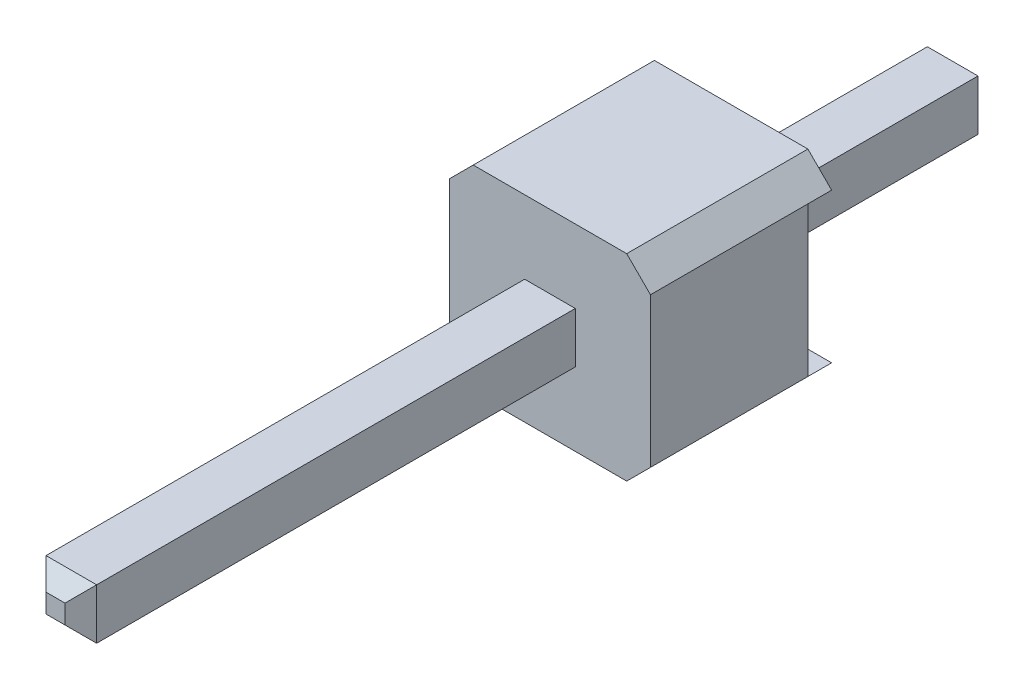
ISO-10303-21;
HEADER;
FILE_DESCRIPTION(('STEP AP214'),'2;1');
FILE_NAME('part.step','',(''),(''),'','','');
FILE_SCHEMA(('AUTOMOTIVE_DESIGN { 1 0 10303 214 1 1 1 1 }'));
ENDSEC;
DATA;
#1=APPLICATION_CONTEXT('core data for automotive mechanical design processes');
#2=APPLICATION_PROTOCOL_DEFINITION('international standard','automotive_design',2000,#1);
#3=PRODUCT_CONTEXT('',#1,'mechanical');
#4=PRODUCT('Part','Part','',(#3));
#5=PRODUCT_RELATED_PRODUCT_CATEGORY('part','',(#4));
#6=PRODUCT_DEFINITION_FORMATION('','',#4);
#7=PRODUCT_DEFINITION_CONTEXT('part definition',#1,'design');
#8=PRODUCT_DEFINITION('design','',#6,#7);
#9=PRODUCT_DEFINITION_SHAPE('','',#8);
#10=(LENGTH_UNIT() NAMED_UNIT(*) SI_UNIT(.MILLI.,.METRE.));
#11=(NAMED_UNIT(*) PLANE_ANGLE_UNIT() SI_UNIT($,.RADIAN.));
#12=(NAMED_UNIT(*) SI_UNIT($,.STERADIAN.) SOLID_ANGLE_UNIT());
#13=UNCERTAINTY_MEASURE_WITH_UNIT(LENGTH_MEASURE(1.E-05),#10,'distance_accuracy_value','');
#14=(GEOMETRIC_REPRESENTATION_CONTEXT(3) GLOBAL_UNCERTAINTY_ASSIGNED_CONTEXT((#13)) GLOBAL_UNIT_ASSIGNED_CONTEXT((#10,
#11,#12)) REPRESENTATION_CONTEXT('',''));
#15=CARTESIAN_POINT('',(0.,0.,0.));
#16=DIRECTION('',(0.,0.,1.));
#17=DIRECTION('',(1.,0.,0.));
#18=AXIS2_PLACEMENT_3D('',#15,#16,#17);
#19=CARTESIAN_POINT('',(18.099999732971,-0.21999999851,8.439999960363));
#20=DIRECTION('',(0.,-0.707106781186548,0.707106781186548));
#21=DIRECTION('',(0.,-0.707106781186548,-0.707106781186548));
#22=AXIS2_PLACEMENT_3D('',#19,#20,#21);
#23=PLANE('',#22);
#24=DIRECTION('',(1.,0.,0.));
#25=VECTOR('',#24,1.);
#26=CARTESIAN_POINT('',(18.099999732971,-0.32,8.339999958873));
#27=LINE('',#26,#25);
#28=CARTESIAN_POINT('',(18.099999732971,-0.32,8.339999958873));
#29=VERTEX_POINT('',#28);
#30=CARTESIAN_POINT('',(17.459999732971,-0.32,8.339999958873));
#31=VERTEX_POINT('',#30);
#32=EDGE_CURVE('P0_E104',#29,#31,#27,.F.);
#33=ORIENTED_EDGE('',*,*,#32,.F.);
#34=DIRECTION('',(0.57735026918963,-0.577350269189618,-0.57735026918963));
#35=VECTOR('',#34,1.);
#36=CARTESIAN_POINT('',(17.899999729991,-0.11999999702,8.539999961853));
#37=LINE('',#36,#35);
#38=CARTESIAN_POINT('',(17.899999729991,-0.11999999702,8.539999961853));
#39=VERTEX_POINT('',#38);
#40=EDGE_CURVE('P0_E85',#39,#29,#37,.T.);
#41=ORIENTED_EDGE('',*,*,#40,.F.);
#42=DIRECTION('',(1.,0.,0.));
#43=VECTOR('',#42,1.);
#44=CARTESIAN_POINT('',(17.459999732971,-0.11999999702,8.539999961853));
#45=LINE('',#44,#43);
#46=CARTESIAN_POINT('',(17.659999735951,-0.11999999702,8.539999961853));
#47=VERTEX_POINT('',#46);
#48=EDGE_CURVE('P0_E19',#47,#39,#45,.T.);
#49=ORIENTED_EDGE('',*,*,#48,.F.);
#50=DIRECTION('',(0.577350269189624,0.577350269189623,0.577350269189629));
#51=VECTOR('',#50,1.);
#52=CARTESIAN_POINT('',(17.459999732971,-0.32,8.339999958873));
#53=LINE('',#52,#51);
#54=EDGE_CURVE('P0_E82',#31,#47,#53,.T.);
#55=ORIENTED_EDGE('',*,*,#54,.F.);
#56=EDGE_LOOP('',(#33,#41,#49,#55));
#57=FACE_BOUND('',#56,.T.);
#58=ADVANCED_FACE('P0_F16',(#57),#23,.T.);
#59=CARTESIAN_POINT('',(18.099999732971,-0.21999999851,-2.89999999851));
#60=DIRECTION('',(0.,0.707106781186548,0.707106781186548));
#61=DIRECTION('',(0.,-0.707106781186548,0.707106781186548));
#62=AXIS2_PLACEMENT_3D('',#59,#60,#61);
#63=PLANE('',#62);
#64=DIRECTION('',(1.,0.,0.));
#65=VECTOR('',#64,1.);
#66=CARTESIAN_POINT('',(18.099999732971,-0.32,-2.79999999702));
#67=LINE('',#66,#65);
#68=CARTESIAN_POINT('',(17.459999732971,-0.32,-2.79999999702));
#69=VERTEX_POINT('',#68);
#70=CARTESIAN_POINT('',(18.099999732971,-0.32,-2.79999999702));
#71=VERTEX_POINT('',#70);
#72=EDGE_CURVE('P0_E106',#69,#71,#67,.T.);
#73=ORIENTED_EDGE('',*,*,#72,.F.);
#74=DIRECTION('',(0.577350269189626,0.577350269189625,-0.577350269189626));
#75=VECTOR('',#74,1.);
#76=CARTESIAN_POINT('',(17.459999732971,-0.32,-2.79999999702));
#77=LINE('',#76,#75);
#78=CARTESIAN_POINT('',(17.659999735951,-0.11999999702,-3.));
#79=VERTEX_POINT('',#78);
#80=EDGE_CURVE('P0_E118',#69,#79,#77,.T.);
#81=ORIENTED_EDGE('',*,*,#80,.T.);
#82=DIRECTION('',(1.,0.,0.));
#83=VECTOR('',#82,1.);
#84=CARTESIAN_POINT('',(17.459999732971,-0.11999999702,-3.));
#85=LINE('',#84,#83);
#86=CARTESIAN_POINT('',(17.899999729991,-0.11999999702,-3.));
#87=VERTEX_POINT('',#86);
#88=EDGE_CURVE('P0_E109',#79,#87,#85,.T.);
#89=ORIENTED_EDGE('',*,*,#88,.T.);
#90=DIRECTION('',(0.57735026918963,-0.577350269189619,0.577350269189628));
#91=VECTOR('',#90,1.);
#92=CARTESIAN_POINT('',(17.899999729991,-0.11999999702,-3.));
#93=LINE('',#92,#91);
#94=EDGE_CURVE('P0_E114',#87,#71,#93,.T.);
#95=ORIENTED_EDGE('',*,*,#94,.T.);
#96=EDGE_LOOP('',(#73,#81,#89,#95));
#97=FACE_BOUND('',#96,.T.);
#98=ADVANCED_FACE('P0_F183',(#97),#63,.F.);
#99=CARTESIAN_POINT('',(17.459999732971,0.32,8.539999961853));
#100=DIRECTION('',(0.,0.,1.));
#101=DIRECTION('',(1.,0.,0.));
#102=AXIS2_PLACEMENT_3D('',#99,#100,#101);
#103=PLANE('',#102);
#104=DIRECTION('',(0.,1.,0.));
#105=VECTOR('',#104,1.);
#106=CARTESIAN_POINT('',(17.899999729991,0.32,8.539999961853));
#107=LINE('',#106,#105);
#108=CARTESIAN_POINT('',(17.899999729991,0.11999999702,8.539999961853));
#109=VERTEX_POINT('',#108);
#110=EDGE_CURVE('P0_E99',#109,#39,#107,.F.);
#111=ORIENTED_EDGE('',*,*,#110,.F.);
#112=DIRECTION('',(1.,0.,0.));
#113=VECTOR('',#112,1.);
#114=CARTESIAN_POINT('',(17.459999732971,0.11999999702,8.539999961853));
#115=LINE('',#114,#113);
#116=CARTESIAN_POINT('',(17.659999735951,0.11999999702,8.539999961853));
#117=VERTEX_POINT('',#116);
#118=EDGE_CURVE('P0_E91',#117,#109,#115,.T.);
#119=ORIENTED_EDGE('',*,*,#118,.F.);
#120=DIRECTION('',(0.,1.,0.));
#121=VECTOR('',#120,1.);
#122=CARTESIAN_POINT('',(17.659999735951,-0.32,8.539999961853));
#123=LINE('',#122,#121);
#124=EDGE_CURVE('P0_E87',#47,#117,#123,.T.);
#125=ORIENTED_EDGE('',*,*,#124,.F.);
#126=ORIENTED_EDGE('',*,*,#48,.T.);
#127=EDGE_LOOP('',(#111,#119,#125,#126));
#128=FACE_BOUND('',#127,.T.);
#129=ADVANCED_FACE('P0_F89',(#128),#103,.T.);
#130=CARTESIAN_POINT('',(17.559999734461,-0.32,8.439999960363));
#131=DIRECTION('',(-0.707106781186548,0.,0.707106781186548));
#132=DIRECTION('',(0.707106781186548,0.,0.707106781186548));
#133=AXIS2_PLACEMENT_3D('',#130,#131,#132);
#134=PLANE('',#133);
#135=DIRECTION('',(0.,1.,0.));
#136=VECTOR('',#135,1.);
#137=CARTESIAN_POINT('',(17.459999732971,-0.32,8.339999958873));
#138=LINE('',#137,#136);
#139=CARTESIAN_POINT('',(17.459999732971,0.32,8.339999958873));
#140=VERTEX_POINT('',#139);
#141=EDGE_CURVE('P0_E97',#31,#140,#138,.T.);
#142=ORIENTED_EDGE('',*,*,#141,.F.);
#143=ORIENTED_EDGE('',*,*,#54,.T.);
#144=ORIENTED_EDGE('',*,*,#124,.T.);
#145=DIRECTION('',(0.577350269189626,-0.577350269189627,0.577350269189626));
#146=VECTOR('',#145,1.);
#147=CARTESIAN_POINT('',(17.459999732971,0.320000000000001,8.339999958873));
#148=LINE('',#147,#146);
#149=EDGE_CURVE('P0_E131',#140,#117,#148,.T.);
#150=ORIENTED_EDGE('',*,*,#149,.F.);
#151=EDGE_LOOP('',(#142,#143,#144,#150));
#152=FACE_BOUND('',#151,.T.);
#153=ADVANCED_FACE('P0_F95',(#152),#134,.T.);
#154=CARTESIAN_POINT('',(17.999999731481,0.32,8.439999960363));
#155=DIRECTION('',(0.707106781186548,0.,0.707106781186548));
#156=DIRECTION('',(0.707106781186548,0.,-0.707106781186548));
#157=AXIS2_PLACEMENT_3D('',#154,#155,#156);
#158=PLANE('',#157);
#159=DIRECTION('',(0.,1.,0.));
#160=VECTOR('',#159,1.);
#161=CARTESIAN_POINT('',(18.099999732971,0.32,8.339999958873));
#162=LINE('',#161,#160);
#163=CARTESIAN_POINT('',(18.099999732971,0.32,8.339999958873));
#164=VERTEX_POINT('',#163);
#165=EDGE_CURVE('P0_E133',#164,#29,#162,.F.);
#166=ORIENTED_EDGE('',*,*,#165,.F.);
#167=DIRECTION('',(0.577350269189632,0.577350269189623,-0.577350269189622));
#168=VECTOR('',#167,1.);
#169=CARTESIAN_POINT('',(17.899999729991,0.11999999702,8.539999961853));
#170=LINE('',#169,#168);
#171=EDGE_CURVE('P0_E128',#109,#164,#170,.T.);
#172=ORIENTED_EDGE('',*,*,#171,.F.);
#173=ORIENTED_EDGE('',*,*,#110,.T.);
#174=ORIENTED_EDGE('',*,*,#40,.T.);
#175=EDGE_LOOP('',(#166,#172,#173,#174));
#176=FACE_BOUND('',#175,.T.);
#177=ADVANCED_FACE('P0_F179',(#176),#158,.T.);
#178=CARTESIAN_POINT('',(18.099999732971,-0.32,-3.));
#179=DIRECTION('',(0.,-1.,0.));
#180=DIRECTION('',(0.,0.,-1.));
#181=AXIS2_PLACEMENT_3D('',#178,#179,#180);
#182=PLANE('',#181);
#183=DIRECTION('',(0.,0.,1.));
#184=VECTOR('',#183,1.);
#185=CARTESIAN_POINT('',(17.459999732971,-0.32,-3.));
#186=LINE('',#185,#184);
#187=EDGE_CURVE('P0_E121',#69,#31,#186,.T.);
#188=ORIENTED_EDGE('',*,*,#187,.F.);
#189=ORIENTED_EDGE('',*,*,#72,.T.);
#190=DIRECTION('',(0.,0.,-1.));
#191=VECTOR('',#190,1.);
#192=CARTESIAN_POINT('',(18.099999732971,-0.32,-3.));
#193=LINE('',#192,#191);
#194=EDGE_CURVE('P0_E136',#29,#71,#193,.T.);
#195=ORIENTED_EDGE('',*,*,#194,.F.);
#196=ORIENTED_EDGE('',*,*,#32,.T.);
#197=EDGE_LOOP('',(#188,#189,#195,#196));
#198=FACE_BOUND('',#197,.T.);
#199=ADVANCED_FACE('P0_F181',(#198),#182,.T.);
#200=CARTESIAN_POINT('',(17.459999732971,0.32,-3.));
#201=DIRECTION('',(0.,0.,1.));
#202=DIRECTION('',(1.,0.,0.));
#203=AXIS2_PLACEMENT_3D('',#200,#201,#202);
#204=PLANE('',#203);
#205=DIRECTION('',(1.,0.,0.));
#206=VECTOR('',#205,1.);
#207=CARTESIAN_POINT('',(17.459999732971,0.11999999702,-3.));
#208=LINE('',#207,#206);
#209=CARTESIAN_POINT('',(17.659999735951,0.11999999702,-3.));
#210=VERTEX_POINT('',#209);
#211=CARTESIAN_POINT('',(17.899999729991,0.11999999702,-3.));
#212=VERTEX_POINT('',#211);
#213=EDGE_CURVE('P0_E141',#210,#212,#208,.T.);
#214=ORIENTED_EDGE('',*,*,#213,.T.);
#215=DIRECTION('',(0.,1.,0.));
#216=VECTOR('',#215,1.);
#217=CARTESIAN_POINT('',(17.899999729991,0.32,-3.));
#218=LINE('',#217,#216);
#219=EDGE_CURVE('P0_E111',#212,#87,#218,.F.);
#220=ORIENTED_EDGE('',*,*,#219,.T.);
#221=ORIENTED_EDGE('',*,*,#88,.F.);
#222=DIRECTION('',(0.,1.,0.));
#223=VECTOR('',#222,1.);
#224=CARTESIAN_POINT('',(17.659999735951,-0.32,-3.));
#225=LINE('',#224,#223);
#226=EDGE_CURVE('P0_E116',#79,#210,#225,.T.);
#227=ORIENTED_EDGE('',*,*,#226,.T.);
#228=EDGE_LOOP('',(#214,#220,#221,#227));
#229=FACE_BOUND('',#228,.T.);
#230=ADVANCED_FACE('P0_F186',(#229),#204,.F.);
#231=CARTESIAN_POINT('',(17.999999731481,0.32,-2.89999999851));
#232=DIRECTION('',(-0.707106781186548,0.,0.707106781186548));
#233=DIRECTION('',(0.707106781186548,0.,0.707106781186548));
#234=AXIS2_PLACEMENT_3D('',#231,#232,#233);
#235=PLANE('',#234);
#236=DIRECTION('',(0.,1.,0.));
#237=VECTOR('',#236,1.);
#238=CARTESIAN_POINT('',(18.099999732971,0.32,-2.79999999702));
#239=LINE('',#238,#237);
#240=CARTESIAN_POINT('',(18.099999732971,0.32,-2.79999999702));
#241=VERTEX_POINT('',#240);
#242=EDGE_CURVE('P0_E139',#71,#241,#239,.T.);
#243=ORIENTED_EDGE('',*,*,#242,.F.);
#244=ORIENTED_EDGE('',*,*,#94,.F.);
#245=ORIENTED_EDGE('',*,*,#219,.F.);
#246=DIRECTION('',(0.577350269189633,0.577350269189622,0.577350269189622));
#247=VECTOR('',#246,1.);
#248=CARTESIAN_POINT('',(17.899999729991,0.11999999702,-3.));
#249=LINE('',#248,#247);
#250=EDGE_CURVE('P0_E34',#212,#241,#249,.T.);
#251=ORIENTED_EDGE('',*,*,#250,.T.);
#252=EDGE_LOOP('',(#243,#244,#245,#251));
#253=FACE_BOUND('',#252,.T.);
#254=ADVANCED_FACE('P0_F184',(#253),#235,.F.);
#255=CARTESIAN_POINT('',(17.559999734461,-0.32,-2.89999999851));
#256=DIRECTION('',(0.707106781186548,0.,0.707106781186548));
#257=DIRECTION('',(0.707106781186548,0.,-0.707106781186548));
#258=AXIS2_PLACEMENT_3D('',#255,#256,#257);
#259=PLANE('',#258);
#260=DIRECTION('',(0.,1.,0.));
#261=VECTOR('',#260,1.);
#262=CARTESIAN_POINT('',(17.459999732971,-0.32,-2.79999999702));
#263=LINE('',#262,#261);
#264=CARTESIAN_POINT('',(17.459999732971,0.32,-2.79999999702));
#265=VERTEX_POINT('',#264);
#266=EDGE_CURVE('P0_E124',#265,#69,#263,.F.);
#267=ORIENTED_EDGE('',*,*,#266,.F.);
#268=DIRECTION('',(0.577350269189627,-0.577350269189625,-0.577350269189625));
#269=VECTOR('',#268,1.);
#270=CARTESIAN_POINT('',(17.459999732971,0.32,-2.79999999702));
#271=LINE('',#270,#269);
#272=EDGE_CURVE('P0_E144',#265,#210,#271,.T.);
#273=ORIENTED_EDGE('',*,*,#272,.T.);
#274=ORIENTED_EDGE('',*,*,#226,.F.);
#275=ORIENTED_EDGE('',*,*,#80,.F.);
#276=EDGE_LOOP('',(#267,#273,#274,#275));
#277=FACE_BOUND('',#276,.T.);
#278=ADVANCED_FACE('P0_F169',(#277),#259,.F.);
#279=CARTESIAN_POINT('',(17.459999732971,-0.32,-3.));
#280=DIRECTION('',(-1.,0.,0.));
#281=DIRECTION('',(0.,0.,1.));
#282=AXIS2_PLACEMENT_3D('',#279,#280,#281);
#283=PLANE('',#282);
#284=DIRECTION('',(0.,0.,1.));
#285=VECTOR('',#284,1.);
#286=CARTESIAN_POINT('',(17.459999732971,0.32,-3.));
#287=LINE('',#286,#285);
#288=EDGE_CURVE('P0_E147',#265,#140,#287,.T.);
#289=ORIENTED_EDGE('',*,*,#288,.F.);
#290=ORIENTED_EDGE('',*,*,#266,.T.);
#291=ORIENTED_EDGE('',*,*,#187,.T.);
#292=ORIENTED_EDGE('',*,*,#141,.T.);
#293=EDGE_LOOP('',(#289,#290,#291,#292));
#294=FACE_BOUND('',#293,.T.);
#295=ADVANCED_FACE('P0_F173',(#294),#283,.T.);
#296=CARTESIAN_POINT('',(17.459999732971,0.21999999851,8.439999960363));
#297=DIRECTION('',(0.,0.707106781186548,0.707106781186548));
#298=DIRECTION('',(0.,-0.707106781186548,0.707106781186548));
#299=AXIS2_PLACEMENT_3D('',#296,#297,#298);
#300=PLANE('',#299);
#301=DIRECTION('',(1.,0.,0.));
#302=VECTOR('',#301,1.);
#303=CARTESIAN_POINT('',(17.459999732971,0.32,8.339999958873));
#304=LINE('',#303,#302);
#305=EDGE_CURVE('P0_E150',#140,#164,#304,.T.);
#306=ORIENTED_EDGE('',*,*,#305,.F.);
#307=ORIENTED_EDGE('',*,*,#149,.T.);
#308=ORIENTED_EDGE('',*,*,#118,.T.);
#309=ORIENTED_EDGE('',*,*,#171,.T.);
#310=EDGE_LOOP('',(#306,#307,#308,#309));
#311=FACE_BOUND('',#310,.T.);
#312=ADVANCED_FACE('P0_F176',(#311),#300,.T.);
#313=CARTESIAN_POINT('',(18.099999732971,0.32,-3.));
#314=DIRECTION('',(1.,0.,0.));
#315=DIRECTION('',(0.,0.,-1.));
#316=AXIS2_PLACEMENT_3D('',#313,#314,#315);
#317=PLANE('',#316);
#318=ORIENTED_EDGE('',*,*,#194,.T.);
#319=ORIENTED_EDGE('',*,*,#242,.T.);
#320=DIRECTION('',(0.,0.,1.));
#321=VECTOR('',#320,1.);
#322=CARTESIAN_POINT('',(18.099999732971,0.32,-3.));
#323=LINE('',#322,#321);
#324=EDGE_CURVE('P0_E25',#164,#241,#323,.F.);
#325=ORIENTED_EDGE('',*,*,#324,.F.);
#326=ORIENTED_EDGE('',*,*,#165,.T.);
#327=EDGE_LOOP('',(#318,#319,#325,#326));
#328=FACE_BOUND('',#327,.T.);
#329=ADVANCED_FACE('P0_F160',(#328),#317,.T.);
#330=CARTESIAN_POINT('',(17.459999732971,0.21999999851,-2.89999999851));
#331=DIRECTION('',(0.,-0.707106781186548,0.707106781186548));
#332=DIRECTION('',(0.,-0.707106781186548,-0.707106781186548));
#333=AXIS2_PLACEMENT_3D('',#330,#331,#332);
#334=PLANE('',#333);
#335=DIRECTION('',(1.,0.,0.));
#336=VECTOR('',#335,1.);
#337=CARTESIAN_POINT('',(17.459999732971,0.32,-2.79999999702));
#338=LINE('',#337,#336);
#339=EDGE_CURVE('P0_E11',#241,#265,#338,.F.);
#340=ORIENTED_EDGE('',*,*,#339,.F.);
#341=ORIENTED_EDGE('',*,*,#250,.F.);
#342=ORIENTED_EDGE('',*,*,#213,.F.);
#343=ORIENTED_EDGE('',*,*,#272,.F.);
#344=EDGE_LOOP('',(#340,#341,#342,#343));
#345=FACE_BOUND('',#344,.T.);
#346=ADVANCED_FACE('P0_F165',(#345),#334,.F.);
#347=CARTESIAN_POINT('',(17.459999732971,0.32,-3.));
#348=DIRECTION('',(0.,1.,0.));
#349=DIRECTION('',(0.,0.,1.));
#350=AXIS2_PLACEMENT_3D('',#347,#348,#349);
#351=PLANE('',#350);
#352=ORIENTED_EDGE('',*,*,#324,.T.);
#353=ORIENTED_EDGE('',*,*,#339,.T.);
#354=ORIENTED_EDGE('',*,*,#288,.T.);
#355=ORIENTED_EDGE('',*,*,#305,.T.);
#356=EDGE_LOOP('',(#352,#353,#354,#355));
#357=FACE_BOUND('',#356,.T.);
#358=ADVANCED_FACE('P0_F156',(#357),#351,.T.);
#359=CLOSED_SHELL('',(#58,#98,#129,#153,#177,#199,#230,#254,#278,#295,#312,#329,#346,#358));
#360=MANIFOLD_SOLID_BREP('P0_B1',#359);
#361=CARTESIAN_POINT('',(16.509999732971,-0.944999988079,0.));
#362=DIRECTION('',(0.,1.,0.));
#363=DIRECTION('',(0.,0.,1.));
#364=AXIS2_PLACEMENT_3D('',#361,#362,#363);
#365=PLANE('',#364);
#366=DIRECTION('',(0.,0.,1.));
#367=VECTOR('',#366,1.);
#368=CARTESIAN_POINT('',(19.0499997329715,-0.944999988079501,0.));
#369=LINE('',#368,#367);
#370=CARTESIAN_POINT('',(19.0499997329711,-0.944999988079125,0.));
#371=VERTEX_POINT('',#370);
#372=CARTESIAN_POINT('',(19.0499997329711,-0.944999988079063,0.300000011921));
#373=VERTEX_POINT('',#372);
#374=EDGE_CURVE('P1_E161',#371,#373,#369,.T.);
#375=ORIENTED_EDGE('',*,*,#374,.F.);
#376=DIRECTION('',(1.,0.,0.));
#377=VECTOR('',#376,1.);
#378=CARTESIAN_POINT('',(16.509999732971,-0.944999988079,0.));
#379=LINE('',#378,#377);
#380=CARTESIAN_POINT('',(16.509999732971,-0.944999988079,0.));
#381=VERTEX_POINT('',#380);
#382=EDGE_CURVE('P1_E111',#371,#381,#379,.F.);
#383=ORIENTED_EDGE('',*,*,#382,.T.);
#384=DIRECTION('',(0.,0.,1.));
#385=VECTOR('',#384,1.);
#386=CARTESIAN_POINT('',(16.509999732971,-0.944999988079,0.));
#387=LINE('',#386,#385);
#388=CARTESIAN_POINT('',(16.509999732971,-0.944999988079,0.300000011921));
#389=VERTEX_POINT('',#388);
#390=EDGE_CURVE('P1_E147',#389,#381,#387,.F.);
#391=ORIENTED_EDGE('',*,*,#390,.F.);
#392=DIRECTION('',(-1.,0.,0.));
#393=VECTOR('',#392,1.);
#394=CARTESIAN_POINT('',(16.509999732971,-0.944999988079,0.300000011921));
#395=LINE('',#394,#393);
#396=EDGE_CURVE('P1_E174',#373,#389,#395,.T.);
#397=ORIENTED_EDGE('',*,*,#396,.F.);
#398=EDGE_LOOP('',(#375,#383,#391,#397));
#399=FACE_BOUND('',#398,.T.);
#400=ADVANCED_FACE('P1_F15',(#399),#365,.T.);
#401=CARTESIAN_POINT('',(19.049999732971,0.944999988079,0.));
#402=DIRECTION('',(0.,-1.,0.));
#403=DIRECTION('',(0.,0.,-1.));
#404=AXIS2_PLACEMENT_3D('',#401,#402,#403);
#405=PLANE('',#404);
#406=DIRECTION('',(0.,0.,1.));
#407=VECTOR('',#406,1.);
#408=CARTESIAN_POINT('',(16.509999732971,0.944999988079,0.));
#409=LINE('',#408,#407);
#410=CARTESIAN_POINT('',(16.509999732971,0.944999988079,0.));
#411=VERTEX_POINT('',#410);
#412=CARTESIAN_POINT('',(16.509999732971,0.944999988079,0.300000011921));
#413=VERTEX_POINT('',#412);
#414=EDGE_CURVE('P1_E116',#411,#413,#409,.T.);
#415=ORIENTED_EDGE('',*,*,#414,.F.);
#416=DIRECTION('',(1.,0.,0.));
#417=VECTOR('',#416,1.);
#418=CARTESIAN_POINT('',(16.509999732971,0.944999988079,0.));
#419=LINE('',#418,#417);
#420=CARTESIAN_POINT('',(19.0499997329711,0.944999988079125,0.));
#421=VERTEX_POINT('',#420);
#422=EDGE_CURVE('P1_E119',#411,#421,#419,.T.);
#423=ORIENTED_EDGE('',*,*,#422,.T.);
#424=DIRECTION('',(0.,0.,1.));
#425=VECTOR('',#424,1.);
#426=CARTESIAN_POINT('',(19.0499997329715,0.944999988079501,0.));
#427=LINE('',#426,#425);
#428=CARTESIAN_POINT('',(19.0499997329711,0.944999988079063,0.300000011921));
#429=VERTEX_POINT('',#428);
#430=EDGE_CURVE('P1_E156',#429,#421,#427,.F.);
#431=ORIENTED_EDGE('',*,*,#430,.F.);
#432=DIRECTION('',(-1.,0.,0.));
#433=VECTOR('',#432,1.);
#434=CARTESIAN_POINT('',(16.509999732971,0.944999988079,0.300000011921));
#435=LINE('',#434,#433);
#436=EDGE_CURVE('P1_E122',#413,#429,#435,.F.);
#437=ORIENTED_EDGE('',*,*,#436,.F.);
#438=EDGE_LOOP('',(#415,#423,#431,#437));
#439=FACE_BOUND('',#438,.T.);
#440=ADVANCED_FACE('P1_F118',(#439),#405,.T.);
#441=CARTESIAN_POINT('',(17.459999732971,0.32,2.289999961853));
#442=DIRECTION('',(0.,-1.,0.));
#443=DIRECTION('',(0.,0.,-1.));
#444=AXIS2_PLACEMENT_3D('',#441,#442,#443);
#445=PLANE('',#444);
#446=DIRECTION('',(0.,0.,1.));
#447=VECTOR('',#446,1.);
#448=CARTESIAN_POINT('',(18.099999732971,0.32,2.289999961853));
#449=LINE('',#448,#447);
#450=CARTESIAN_POINT('',(18.099999732971,0.32,2.289999961853));
#451=VERTEX_POINT('',#450);
#452=CARTESIAN_POINT('',(18.099999732971,0.32,0.300000011921));
#453=VERTEX_POINT('',#452);
#454=EDGE_CURVE('P1_E166',#451,#453,#449,.F.);
#455=ORIENTED_EDGE('',*,*,#454,.F.);
#456=DIRECTION('',(1.,0.,0.));
#457=VECTOR('',#456,1.);
#458=CARTESIAN_POINT('',(17.459999732971,0.32,2.289999961853));
#459=LINE('',#458,#457);
#460=CARTESIAN_POINT('',(17.459999732971,0.32,2.289999961853));
#461=VERTEX_POINT('',#460);
#462=EDGE_CURVE('P1_E18',#451,#461,#459,.F.);
#463=ORIENTED_EDGE('',*,*,#462,.T.);
#464=DIRECTION('',(0.,0.,-1.));
#465=VECTOR('',#464,1.);
#466=CARTESIAN_POINT('',(17.459999732971,0.32,2.289999961853));
#467=LINE('',#466,#465);
#468=CARTESIAN_POINT('',(17.459999732971,0.32,0.300000011921));
#469=VERTEX_POINT('',#468);
#470=EDGE_CURVE('P1_E181',#469,#461,#467,.F.);
#471=ORIENTED_EDGE('',*,*,#470,.F.);
#472=DIRECTION('',(-1.,0.,0.));
#473=VECTOR('',#472,1.);
#474=CARTESIAN_POINT('',(16.509999732971,0.32,0.300000011921));
#475=LINE('',#474,#473);
#476=EDGE_CURVE('P1_E172',#453,#469,#475,.T.);
#477=ORIENTED_EDGE('',*,*,#476,.F.);
#478=EDGE_LOOP('',(#455,#463,#471,#477));
#479=FACE_BOUND('',#478,.T.);
#480=ADVANCED_FACE('P1_F278',(#479),#445,.T.);
#481=CARTESIAN_POINT('',(16.509999732971,1.245,0.));
#482=DIRECTION('',(0.,0.,1.));
#483=DIRECTION('',(1.,0.,0.));
#484=AXIS2_PLACEMENT_3D('',#481,#482,#483);
#485=PLANE('',#484);
#486=ORIENTED_EDGE('',*,*,#422,.F.);
#487=DIRECTION('',(-0.707106781186548,-0.707106781186548,0.));
#488=VECTOR('',#487,1.);
#489=CARTESIAN_POINT('',(16.659999738932,1.09499999404,0.));
#490=LINE('',#489,#488);
#491=CARTESIAN_POINT('',(16.809999744892,1.245,0.));
#492=VERTEX_POINT('',#491);
#493=EDGE_CURVE('P1_E132',#492,#411,#490,.T.);
#494=ORIENTED_EDGE('',*,*,#493,.F.);
#495=DIRECTION('',(1.,0.,0.));
#496=VECTOR('',#495,1.);
#497=CARTESIAN_POINT('',(16.509999732971,1.245,0.));
#498=LINE('',#497,#496);
#499=CARTESIAN_POINT('',(18.7499997210501,1.24500000000013,0.));
#500=VERTEX_POINT('',#499);
#501=EDGE_CURVE('P1_E186',#500,#492,#498,.F.);
#502=ORIENTED_EDGE('',*,*,#501,.F.);
#503=DIRECTION('',(-0.707106781186548,0.707106781186548,0.));
#504=VECTOR('',#503,1.);
#505=CARTESIAN_POINT('',(18.899999727011,1.09499999404,0.));
#506=LINE('',#505,#504);
#507=EDGE_CURVE('P1_E135',#421,#500,#506,.T.);
#508=ORIENTED_EDGE('',*,*,#507,.F.);
#509=EDGE_LOOP('',(#486,#494,#502,#508));
#510=FACE_BOUND('',#509,.T.);
#511=ADVANCED_FACE('P1_F131',(#510),#485,.F.);
#512=CARTESIAN_POINT('',(16.659999738932,1.09499999404,0.));
#513=DIRECTION('',(-0.707106781186548,0.707106781186548,0.));
#514=DIRECTION('',(-0.707106781186548,-0.707106781186548,0.));
#515=AXIS2_PLACEMENT_3D('',#512,#513,#514);
#516=PLANE('',#515);
#517=DIRECTION('',(0.,0.,1.));
#518=VECTOR('',#517,1.);
#519=CARTESIAN_POINT('',(16.809999744892,1.245,0.));
#520=LINE('',#519,#518);
#521=CARTESIAN_POINT('',(16.809999744892,1.245,2.289999961853));
#522=VERTEX_POINT('',#521);
#523=EDGE_CURVE('P1_E139',#492,#522,#520,.T.);
#524=ORIENTED_EDGE('',*,*,#523,.F.);
#525=ORIENTED_EDGE('',*,*,#493,.T.);
#526=ORIENTED_EDGE('',*,*,#414,.T.);
#527=DIRECTION('',(0.,0.,1.));
#528=VECTOR('',#527,1.);
#529=CARTESIAN_POINT('',(16.509999732971,0.944999988079,0.));
#530=LINE('',#529,#528);
#531=CARTESIAN_POINT('',(16.509999732971,0.944999988079,2.289999961853));
#532=VERTEX_POINT('',#531);
#533=EDGE_CURVE('P1_E198',#532,#413,#530,.F.);
#534=ORIENTED_EDGE('',*,*,#533,.F.);
#535=DIRECTION('',(-0.707106781186548,-0.707106781186548,0.));
#536=VECTOR('',#535,1.);
#537=CARTESIAN_POINT('',(16.659999738932,1.09499999404,2.289999961853));
#538=LINE('',#537,#536);
#539=EDGE_CURVE('P1_E128',#532,#522,#538,.F.);
#540=ORIENTED_EDGE('',*,*,#539,.T.);
#541=EDGE_LOOP('',(#524,#525,#526,#534,#540));
#542=FACE_BOUND('',#541,.T.);
#543=ADVANCED_FACE('P1_F137',(#542),#516,.T.);
#544=CARTESIAN_POINT('',(16.509999732971,1.245,0.));
#545=DIRECTION('',(0.,0.,1.));
#546=DIRECTION('',(1.,0.,0.));
#547=AXIS2_PLACEMENT_3D('',#544,#545,#546);
#548=PLANE('',#547);
#549=DIRECTION('',(1.,0.,0.));
#550=VECTOR('',#549,1.);
#551=CARTESIAN_POINT('',(19.049999732971,-1.245,0.));
#552=LINE('',#551,#550);
#553=CARTESIAN_POINT('',(16.809999744892,-1.245,0.));
#554=VERTEX_POINT('',#553);
#555=CARTESIAN_POINT('',(18.7499997210501,-1.24500000000013,0.));
#556=VERTEX_POINT('',#555);
#557=EDGE_CURVE('P1_E200',#554,#556,#552,.T.);
#558=ORIENTED_EDGE('',*,*,#557,.F.);
#559=DIRECTION('',(0.707106781186548,-0.707106781186548,0.));
#560=VECTOR('',#559,1.);
#561=CARTESIAN_POINT('',(16.659999738932,-1.09499999404,0.));
#562=LINE('',#561,#560);
#563=EDGE_CURVE('P1_E150',#381,#554,#562,.T.);
#564=ORIENTED_EDGE('',*,*,#563,.F.);
#565=ORIENTED_EDGE('',*,*,#382,.F.);
#566=DIRECTION('',(0.707106781186548,0.707106781186548,0.));
#567=VECTOR('',#566,1.);
#568=CARTESIAN_POINT('',(18.899999727011,-1.09499999404,0.));
#569=LINE('',#568,#567);
#570=EDGE_CURVE('P1_E158',#556,#371,#569,.T.);
#571=ORIENTED_EDGE('',*,*,#570,.F.);
#572=EDGE_LOOP('',(#558,#564,#565,#571));
#573=FACE_BOUND('',#572,.T.);
#574=ADVANCED_FACE('P1_F310',(#573),#548,.F.);
#575=CARTESIAN_POINT('',(16.659999738932,-1.09499999404,0.));
#576=DIRECTION('',(-0.707106781186548,-0.707106781186548,0.));
#577=DIRECTION('',(0.707106781186548,-0.707106781186548,0.));
#578=AXIS2_PLACEMENT_3D('',#575,#576,#577);
#579=PLANE('',#578);
#580=ORIENTED_EDGE('',*,*,#390,.T.);
#581=ORIENTED_EDGE('',*,*,#563,.T.);
#582=DIRECTION('',(0.,0.,-1.));
#583=VECTOR('',#582,1.);
#584=CARTESIAN_POINT('',(16.809999744892,-1.245,0.));
#585=LINE('',#584,#583);
#586=CARTESIAN_POINT('',(16.809999744892,-1.245,2.289999961853));
#587=VERTEX_POINT('',#586);
#588=EDGE_CURVE('P1_E206',#587,#554,#585,.T.);
#589=ORIENTED_EDGE('',*,*,#588,.F.);
#590=DIRECTION('',(0.707106781186548,-0.707106781186548,0.));
#591=VECTOR('',#590,1.);
#592=CARTESIAN_POINT('',(16.659999738932,-1.09499999404,2.289999961853));
#593=LINE('',#592,#591);
#594=CARTESIAN_POINT('',(16.509999732971,-0.944999988079,2.289999961853));
#595=VERTEX_POINT('',#594);
#596=EDGE_CURVE('P1_E142',#587,#595,#593,.F.);
#597=ORIENTED_EDGE('',*,*,#596,.T.);
#598=DIRECTION('',(0.,0.,1.));
#599=VECTOR('',#598,1.);
#600=CARTESIAN_POINT('',(16.509999732971,-0.944999988079,0.));
#601=LINE('',#600,#599);
#602=EDGE_CURVE('P1_E195',#389,#595,#601,.T.);
#603=ORIENTED_EDGE('',*,*,#602,.F.);
#604=EDGE_LOOP('',(#580,#581,#589,#597,#603));
#605=FACE_BOUND('',#604,.T.);
#606=ADVANCED_FACE('P1_F256',(#605),#579,.T.);
#607=CARTESIAN_POINT('',(18.899999727011,1.09499999404,0.));
#608=DIRECTION('',(0.707106781186548,0.707106781186548,0.));
#609=DIRECTION('',(-0.707106781186548,0.707106781186548,0.));
#610=AXIS2_PLACEMENT_3D('',#607,#608,#609);
#611=PLANE('',#610);
#612=DIRECTION('',(0.,0.,-1.));
#613=VECTOR('',#612,1.);
#614=CARTESIAN_POINT('',(19.049999732971,0.944999988079,0.));
#615=LINE('',#614,#613);
#616=CARTESIAN_POINT('',(19.0499997329713,0.94499998807925,2.289999961853));
#617=VERTEX_POINT('',#616);
#618=EDGE_CURVE('P1_E212',#429,#617,#615,.F.);
#619=ORIENTED_EDGE('',*,*,#618,.F.);
#620=ORIENTED_EDGE('',*,*,#430,.T.);
#621=ORIENTED_EDGE('',*,*,#507,.T.);
#622=DIRECTION('',(0.,0.,1.));
#623=VECTOR('',#622,1.);
#624=CARTESIAN_POINT('',(18.74999972105,1.245,0.));
#625=LINE('',#624,#623);
#626=CARTESIAN_POINT('',(18.7499997210503,1.24500000000025,2.289999961853));
#627=VERTEX_POINT('',#626);
#628=EDGE_CURVE('P1_E189',#627,#500,#625,.F.);
#629=ORIENTED_EDGE('',*,*,#628,.F.);
#630=DIRECTION('',(-0.707106781186548,0.707106781186548,0.));
#631=VECTOR('',#630,1.);
#632=CARTESIAN_POINT('',(18.899999727011,1.09499999404,2.289999961853));
#633=LINE('',#632,#631);
#634=EDGE_CURVE('P1_E154',#627,#617,#633,.F.);
#635=ORIENTED_EDGE('',*,*,#634,.T.);
#636=EDGE_LOOP('',(#619,#620,#621,#629,#635));
#637=FACE_BOUND('',#636,.T.);
#638=ADVANCED_FACE('P1_F247',(#637),#611,.T.);
#639=CARTESIAN_POINT('',(18.899999727011,-1.09499999404,0.));
#640=DIRECTION('',(0.707106781186548,-0.707106781186548,0.));
#641=DIRECTION('',(0.707106781186548,0.707106781186548,0.));
#642=AXIS2_PLACEMENT_3D('',#639,#640,#641);
#643=PLANE('',#642);
#644=DIRECTION('',(0.707106781186548,0.707106781186548,0.));
#645=VECTOR('',#644,1.);
#646=CARTESIAN_POINT('',(18.899999727011,-1.09499999404,2.289999961853));
#647=LINE('',#646,#645);
#648=CARTESIAN_POINT('',(19.0499997329713,-0.94499998807925,2.289999961853));
#649=VERTEX_POINT('',#648);
#650=CARTESIAN_POINT('',(18.7499997210503,-1.24500000000025,2.289999961853));
#651=VERTEX_POINT('',#650);
#652=EDGE_CURVE('P1_E164',#649,#651,#647,.F.);
#653=ORIENTED_EDGE('',*,*,#652,.T.);
#654=DIRECTION('',(0.,0.,-1.));
#655=VECTOR('',#654,1.);
#656=CARTESIAN_POINT('',(18.74999972105,-1.245,0.));
#657=LINE('',#656,#655);
#658=EDGE_CURVE('P1_E203',#556,#651,#657,.F.);
#659=ORIENTED_EDGE('',*,*,#658,.F.);
#660=ORIENTED_EDGE('',*,*,#570,.T.);
#661=ORIENTED_EDGE('',*,*,#374,.T.);
#662=DIRECTION('',(0.,0.,-1.));
#663=VECTOR('',#662,1.);
#664=CARTESIAN_POINT('',(19.049999732971,-0.944999988079,0.));
#665=LINE('',#664,#663);
#666=EDGE_CURVE('P1_E215',#649,#373,#665,.T.);
#667=ORIENTED_EDGE('',*,*,#666,.F.);
#668=EDGE_LOOP('',(#653,#659,#660,#661,#667));
#669=FACE_BOUND('',#668,.T.);
#670=ADVANCED_FACE('P1_F263',(#669),#643,.T.);
#671=CARTESIAN_POINT('',(18.099999732971,0.32,2.289999961853));
#672=DIRECTION('',(-1.,0.,0.));
#673=DIRECTION('',(0.,0.,1.));
#674=AXIS2_PLACEMENT_3D('',#671,#672,#673);
#675=PLANE('',#674);
#676=DIRECTION('',(0.,0.,1.));
#677=VECTOR('',#676,1.);
#678=CARTESIAN_POINT('',(18.099999732971,-0.32,2.289999961853));
#679=LINE('',#678,#677);
#680=CARTESIAN_POINT('',(18.099999732971,-0.32,2.289999961853));
#681=VERTEX_POINT('',#680);
#682=CARTESIAN_POINT('',(18.099999732971,-0.32,0.300000011921));
#683=VERTEX_POINT('',#682);
#684=EDGE_CURVE('P1_E218',#681,#683,#679,.F.);
#685=ORIENTED_EDGE('',*,*,#684,.F.);
#686=DIRECTION('',(0.,1.,0.));
#687=VECTOR('',#686,1.);
#688=CARTESIAN_POINT('',(18.099999732971,0.32,2.289999961853));
#689=LINE('',#688,#687);
#690=EDGE_CURVE('P1_E32',#681,#451,#689,.T.);
#691=ORIENTED_EDGE('',*,*,#690,.T.);
#692=ORIENTED_EDGE('',*,*,#454,.T.);
#693=DIRECTION('',(0.,1.,0.));
#694=VECTOR('',#693,1.);
#695=CARTESIAN_POINT('',(18.099999732971,-0.944999988079,0.300000011921));
#696=LINE('',#695,#694);
#697=EDGE_CURVE('P1_E169',#683,#453,#696,.T.);
#698=ORIENTED_EDGE('',*,*,#697,.F.);
#699=EDGE_LOOP('',(#685,#691,#692,#698));
#700=FACE_BOUND('',#699,.T.);
#701=ADVANCED_FACE('P1_F269',(#700),#675,.T.);
#702=CARTESIAN_POINT('',(16.509999732971,-0.944999988079,0.300000011921));
#703=DIRECTION('',(0.,0.,-1.));
#704=DIRECTION('',(-1.,0.,0.));
#705=AXIS2_PLACEMENT_3D('',#702,#703,#704);
#706=PLANE('',#705);
#707=ORIENTED_EDGE('',*,*,#436,.T.);
#708=DIRECTION('',(0.,1.,0.));
#709=VECTOR('',#708,1.);
#710=CARTESIAN_POINT('',(19.049999732971,1.245,0.300000011921));
#711=LINE('',#710,#709);
#712=EDGE_CURVE('P1_E209',#373,#429,#711,.T.);
#713=ORIENTED_EDGE('',*,*,#712,.F.);
#714=ORIENTED_EDGE('',*,*,#396,.T.);
#715=DIRECTION('',(0.,1.,0.));
#716=VECTOR('',#715,1.);
#717=CARTESIAN_POINT('',(16.509999732971,-1.245,0.300000011921));
#718=LINE('',#717,#716);
#719=EDGE_CURVE('P1_E192',#413,#389,#718,.F.);
#720=ORIENTED_EDGE('',*,*,#719,.F.);
#721=EDGE_LOOP('',(#707,#713,#714,#720));
#722=FACE_BOUND('',#721,.T.);
#723=ORIENTED_EDGE('',*,*,#697,.T.);
#724=ORIENTED_EDGE('',*,*,#476,.T.);
#725=DIRECTION('',(0.,1.,0.));
#726=VECTOR('',#725,1.);
#727=CARTESIAN_POINT('',(17.459999732971,-0.32,0.300000011921));
#728=LINE('',#727,#726);
#729=CARTESIAN_POINT('',(17.459999732971,-0.32,0.300000011921));
#730=VERTEX_POINT('',#729);
#731=EDGE_CURVE('P1_E178',#730,#469,#728,.T.);
#732=ORIENTED_EDGE('',*,*,#731,.F.);
#733=DIRECTION('',(1.,0.,0.));
#734=VECTOR('',#733,1.);
#735=CARTESIAN_POINT('',(18.099999732971,-0.32,0.300000011921));
#736=LINE('',#735,#734);
#737=EDGE_CURVE('P1_E221',#683,#730,#736,.F.);
#738=ORIENTED_EDGE('',*,*,#737,.F.);
#739=EDGE_LOOP('',(#723,#724,#732,#738));
#740=FACE_BOUND('',#739,.T.);
#741=ADVANCED_FACE('P1_F265',(#722,#740),#706,.T.);
#742=CARTESIAN_POINT('',(17.459999732971,-0.32,2.289999961853));
#743=DIRECTION('',(1.,0.,0.));
#744=DIRECTION('',(0.,0.,-1.));
#745=AXIS2_PLACEMENT_3D('',#742,#743,#744);
#746=PLANE('',#745);
#747=ORIENTED_EDGE('',*,*,#470,.T.);
#748=DIRECTION('',(0.,1.,0.));
#749=VECTOR('',#748,1.);
#750=CARTESIAN_POINT('',(17.459999732971,-0.32,2.289999961853));
#751=LINE('',#750,#749);
#752=CARTESIAN_POINT('',(17.459999732971,-0.32,2.289999961853));
#753=VERTEX_POINT('',#752);
#754=EDGE_CURVE('P1_E184',#461,#753,#751,.F.);
#755=ORIENTED_EDGE('',*,*,#754,.T.);
#756=DIRECTION('',(0.,0.,1.));
#757=VECTOR('',#756,1.);
#758=CARTESIAN_POINT('',(17.459999732971,-0.32,2.289999961853));
#759=LINE('',#758,#757);
#760=EDGE_CURVE('P1_E224',#730,#753,#759,.T.);
#761=ORIENTED_EDGE('',*,*,#760,.F.);
#762=ORIENTED_EDGE('',*,*,#731,.T.);
#763=EDGE_LOOP('',(#747,#755,#761,#762));
#764=FACE_BOUND('',#763,.T.);
#765=ADVANCED_FACE('P1_F268',(#764),#746,.T.);
#766=CARTESIAN_POINT('',(16.509999732971,1.245,0.));
#767=DIRECTION('',(0.,1.,0.));
#768=DIRECTION('',(0.,0.,1.));
#769=AXIS2_PLACEMENT_3D('',#766,#767,#768);
#770=PLANE('',#769);
#771=DIRECTION('',(1.,0.,0.));
#772=VECTOR('',#771,1.);
#773=CARTESIAN_POINT('',(16.509999732971,1.245,2.289999961853));
#774=LINE('',#773,#772);
#775=EDGE_CURVE('P1_E227',#627,#522,#774,.F.);
#776=ORIENTED_EDGE('',*,*,#775,.F.);
#777=ORIENTED_EDGE('',*,*,#628,.T.);
#778=ORIENTED_EDGE('',*,*,#501,.T.);
#779=ORIENTED_EDGE('',*,*,#523,.T.);
#780=EDGE_LOOP('',(#776,#777,#778,#779));
#781=FACE_BOUND('',#780,.T.);
#782=ADVANCED_FACE('P1_F250',(#781),#770,.T.);
#783=CARTESIAN_POINT('',(16.509999732971,-1.245,0.));
#784=DIRECTION('',(-1.,0.,0.));
#785=DIRECTION('',(0.,0.,1.));
#786=AXIS2_PLACEMENT_3D('',#783,#784,#785);
#787=PLANE('',#786);
#788=DIRECTION('',(0.,1.,0.));
#789=VECTOR('',#788,1.);
#790=CARTESIAN_POINT('',(16.509999732971,1.245,2.289999961853));
#791=LINE('',#790,#789);
#792=EDGE_CURVE('P1_E230',#532,#595,#791,.F.);
#793=ORIENTED_EDGE('',*,*,#792,.F.);
#794=ORIENTED_EDGE('',*,*,#533,.T.);
#795=ORIENTED_EDGE('',*,*,#719,.T.);
#796=ORIENTED_EDGE('',*,*,#602,.T.);
#797=EDGE_LOOP('',(#793,#794,#795,#796));
#798=FACE_BOUND('',#797,.T.);
#799=ADVANCED_FACE('P1_F253',(#798),#787,.T.);
#800=CARTESIAN_POINT('',(19.049999732971,-1.245,0.));
#801=DIRECTION('',(0.,-1.,0.));
#802=DIRECTION('',(0.,0.,-1.));
#803=AXIS2_PLACEMENT_3D('',#800,#801,#802);
#804=PLANE('',#803);
#805=DIRECTION('',(1.,0.,0.));
#806=VECTOR('',#805,1.);
#807=CARTESIAN_POINT('',(16.509999732971,-1.245,2.289999961853));
#808=LINE('',#807,#806);
#809=EDGE_CURVE('P1_E233',#587,#651,#808,.T.);
#810=ORIENTED_EDGE('',*,*,#809,.F.);
#811=ORIENTED_EDGE('',*,*,#588,.T.);
#812=ORIENTED_EDGE('',*,*,#557,.T.);
#813=ORIENTED_EDGE('',*,*,#658,.T.);
#814=EDGE_LOOP('',(#810,#811,#812,#813));
#815=FACE_BOUND('',#814,.T.);
#816=ADVANCED_FACE('P1_F260',(#815),#804,.T.);
#817=CARTESIAN_POINT('',(19.049999732971,1.245,0.));
#818=DIRECTION('',(1.,0.,0.));
#819=DIRECTION('',(0.,0.,-1.));
#820=AXIS2_PLACEMENT_3D('',#817,#818,#819);
#821=PLANE('',#820);
#822=DIRECTION('',(0.,1.,0.));
#823=VECTOR('',#822,1.);
#824=CARTESIAN_POINT('',(19.049999732971,1.245,2.289999961853));
#825=LINE('',#824,#823);
#826=EDGE_CURVE('P1_E24',#649,#617,#825,.T.);
#827=ORIENTED_EDGE('',*,*,#826,.F.);
#828=ORIENTED_EDGE('',*,*,#666,.T.);
#829=ORIENTED_EDGE('',*,*,#712,.T.);
#830=ORIENTED_EDGE('',*,*,#618,.T.);
#831=EDGE_LOOP('',(#827,#828,#829,#830));
#832=FACE_BOUND('',#831,.T.);
#833=ADVANCED_FACE('P1_F243',(#832),#821,.T.);
#834=CARTESIAN_POINT('',(18.099999732971,-0.32,2.289999961853));
#835=DIRECTION('',(0.,1.,0.));
#836=DIRECTION('',(0.,0.,1.));
#837=AXIS2_PLACEMENT_3D('',#834,#835,#836);
#838=PLANE('',#837);
#839=ORIENTED_EDGE('',*,*,#760,.T.);
#840=DIRECTION('',(1.,0.,0.));
#841=VECTOR('',#840,1.);
#842=CARTESIAN_POINT('',(16.509999732971,-0.32,2.289999961853));
#843=LINE('',#842,#841);
#844=EDGE_CURVE('P1_E10',#681,#753,#843,.F.);
#845=ORIENTED_EDGE('',*,*,#844,.F.);
#846=ORIENTED_EDGE('',*,*,#684,.T.);
#847=ORIENTED_EDGE('',*,*,#737,.T.);
#848=EDGE_LOOP('',(#839,#845,#846,#847));
#849=FACE_BOUND('',#848,.T.);
#850=ADVANCED_FACE('P1_F283',(#849),#838,.T.);
#851=CARTESIAN_POINT('',(16.509999732971,1.245,2.289999961853));
#852=DIRECTION('',(0.,0.,1.));
#853=DIRECTION('',(1.,0.,0.));
#854=AXIS2_PLACEMENT_3D('',#851,#852,#853);
#855=PLANE('',#854);
#856=ORIENTED_EDGE('',*,*,#690,.F.);
#857=ORIENTED_EDGE('',*,*,#844,.T.);
#858=ORIENTED_EDGE('',*,*,#754,.F.);
#859=ORIENTED_EDGE('',*,*,#462,.F.);
#860=EDGE_LOOP('',(#856,#857,#858,#859));
#861=FACE_BOUND('',#860,.T.);
#862=ORIENTED_EDGE('',*,*,#826,.T.);
#863=ORIENTED_EDGE('',*,*,#634,.F.);
#864=ORIENTED_EDGE('',*,*,#775,.T.);
#865=ORIENTED_EDGE('',*,*,#539,.F.);
#866=ORIENTED_EDGE('',*,*,#792,.T.);
#867=ORIENTED_EDGE('',*,*,#596,.F.);
#868=ORIENTED_EDGE('',*,*,#809,.T.);
#869=ORIENTED_EDGE('',*,*,#652,.F.);
#870=EDGE_LOOP('',(#862,#863,#864,#865,#866,#867,#868,#869));
#871=FACE_BOUND('',#870,.T.);
#872=ADVANCED_FACE('P1_F239',(#861,#871),#855,.T.);
#873=CLOSED_SHELL('',(#400,#440,#480,#511,#543,#574,#606,#638,#670,#701,#741,#765,#782,#799,
#816,#833,#850,#872));
#874=MANIFOLD_SOLID_BREP('P1_B1',#873);
#875=ADVANCED_BREP_SHAPE_REPRESENTATION('',(#18,#360,#874),#14);
#876=SHAPE_DEFINITION_REPRESENTATION(#9,#875);
ENDSEC;
END-ISO-10303-21;
